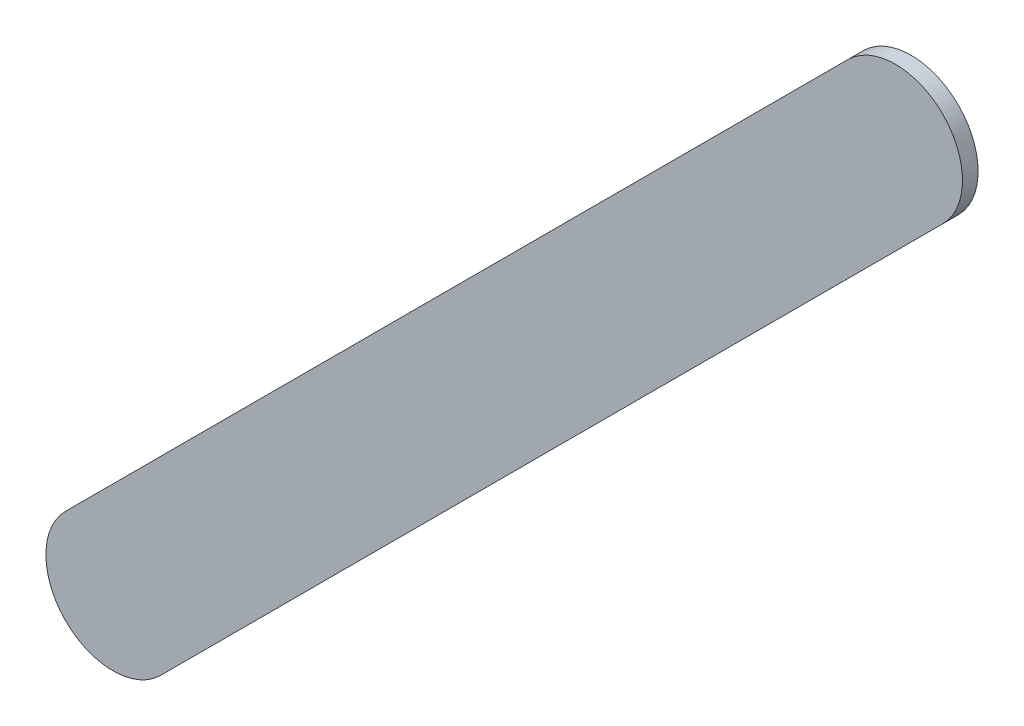
ISO-10303-21;
HEADER;
FILE_DESCRIPTION(('STEP AP214'),'2;1');
FILE_NAME('part.step','',(''),(''),'','','');
FILE_SCHEMA(('AUTOMOTIVE_DESIGN { 1 0 10303 214 1 1 1 1 }'));
ENDSEC;
DATA;
#1=APPLICATION_CONTEXT('core data for automotive mechanical design processes');
#2=APPLICATION_PROTOCOL_DEFINITION('international standard','automotive_design',2000,#1);
#3=PRODUCT_CONTEXT('',#1,'mechanical');
#4=PRODUCT('Part','Part','',(#3));
#5=PRODUCT_RELATED_PRODUCT_CATEGORY('part','',(#4));
#6=PRODUCT_DEFINITION_FORMATION('','',#4);
#7=PRODUCT_DEFINITION_CONTEXT('part definition',#1,'design');
#8=PRODUCT_DEFINITION('design','',#6,#7);
#9=PRODUCT_DEFINITION_SHAPE('','',#8);
#10=(LENGTH_UNIT() NAMED_UNIT(*) SI_UNIT(.MILLI.,.METRE.));
#11=(NAMED_UNIT(*) PLANE_ANGLE_UNIT() SI_UNIT($,.RADIAN.));
#12=(NAMED_UNIT(*) SI_UNIT($,.STERADIAN.) SOLID_ANGLE_UNIT());
#13=UNCERTAINTY_MEASURE_WITH_UNIT(LENGTH_MEASURE(1.E-05),#10,'distance_accuracy_value','');
#14=(GEOMETRIC_REPRESENTATION_CONTEXT(3) GLOBAL_UNCERTAINTY_ASSIGNED_CONTEXT((#13)) GLOBAL_UNIT_ASSIGNED_CONTEXT((#10,
#11,#12)) REPRESENTATION_CONTEXT('',''));
#15=CARTESIAN_POINT('',(0.,0.,0.));
#16=DIRECTION('',(0.,0.,1.));
#17=DIRECTION('',(1.,0.,0.));
#18=AXIS2_PLACEMENT_3D('',#15,#16,#17);
#19=CARTESIAN_POINT('',(85.396066,-74.696066,1.635));
#20=DIRECTION('',(0.,0.,1.));
#21=DIRECTION('',(1.,0.,0.));
#22=AXIS2_PLACEMENT_3D('',#19,#20,#21);
#23=PLANE('',#22);
#24=DIRECTION('',(0.707106781186548,0.707106781186548,0.));
#25=VECTOR('',#24,1.);
#26=CARTESIAN_POINT('',(85.396066,-74.696066,1.635));
#27=LINE('',#26,#25);
#28=CARTESIAN_POINT('',(85.396066,-74.696066,1.635));
#29=VERTEX_POINT('',#28);
#30=CARTESIAN_POINT('',(87.146066,-72.946066,1.635));
#31=VERTEX_POINT('',#30);
#32=EDGE_CURVE('E93',#29,#31,#27,.T.);
#33=ORIENTED_EDGE('',*,*,#32,.T.);
#34=CARTESIAN_POINT('',(87.0399995,-72.8399995,1.635));
#35=DIRECTION('',(0.,0.,1.));
#36=DIRECTION('',(0.707106781186548,-0.707106781186548,0.));
#37=AXIS2_PLACEMENT_3D('',#34,#35,#36);
#38=CIRCLE('',#37,0.150000682813);
#39=CARTESIAN_POINT('',(86.933933,-72.733933,1.635));
#40=VERTEX_POINT('',#39);
#41=EDGE_CURVE('E71',#31,#40,#38,.T.);
#42=ORIENTED_EDGE('',*,*,#41,.T.);
#43=DIRECTION('',(-0.707106781186548,-0.707106781186548,0.));
#44=VECTOR('',#43,1.);
#45=CARTESIAN_POINT('',(86.933933,-72.733933,1.635));
#46=LINE('',#45,#44);
#47=CARTESIAN_POINT('',(85.183933,-74.483933,1.635));
#48=VERTEX_POINT('',#47);
#49=EDGE_CURVE('E76',#40,#48,#46,.T.);
#50=ORIENTED_EDGE('',*,*,#49,.T.);
#51=CARTESIAN_POINT('',(85.2899995,-74.5899995,1.635));
#52=DIRECTION('',(0.,0.,1.));
#53=DIRECTION('',(-0.707106781186548,0.707106781186548,0.));
#54=AXIS2_PLACEMENT_3D('',#51,#52,#53);
#55=CIRCLE('',#54,0.150000682813);
#56=EDGE_CURVE('E11',#48,#29,#55,.T.);
#57=ORIENTED_EDGE('',*,*,#56,.T.);
#58=EDGE_LOOP('',(#33,#42,#50,#57));
#59=FACE_BOUND('',#58,.T.);
#60=ADVANCED_FACE('F17',(#59),#23,.T.);
#61=CARTESIAN_POINT('',(85.396066,-74.696066,1.6));
#62=DIRECTION('',(0.,0.,1.));
#63=DIRECTION('',(1.,0.,0.));
#64=AXIS2_PLACEMENT_3D('',#61,#62,#63);
#65=PLANE('',#64);
#66=CARTESIAN_POINT('',(85.2899995,-74.5899995,1.6));
#67=DIRECTION('',(0.,0.,1.));
#68=DIRECTION('',(-0.707106781186548,0.707106781186548,0.));
#69=AXIS2_PLACEMENT_3D('',#66,#67,#68);
#70=CIRCLE('',#69,0.150000682813);
#71=CARTESIAN_POINT('',(85.183933,-74.483933,1.6));
#72=VERTEX_POINT('',#71);
#73=CARTESIAN_POINT('',(85.396066,-74.696066,1.6));
#74=VERTEX_POINT('',#73);
#75=EDGE_CURVE('E25',#72,#74,#70,.T.);
#76=ORIENTED_EDGE('',*,*,#75,.F.);
#77=DIRECTION('',(-0.707106781186548,-0.707106781186548,0.));
#78=VECTOR('',#77,1.);
#79=CARTESIAN_POINT('',(86.933933,-72.733933,1.6));
#80=LINE('',#79,#78);
#81=CARTESIAN_POINT('',(86.933933,-72.733933,1.6));
#82=VERTEX_POINT('',#81);
#83=EDGE_CURVE('E60',#82,#72,#80,.T.);
#84=ORIENTED_EDGE('',*,*,#83,.F.);
#85=CARTESIAN_POINT('',(87.0399995,-72.8399995,1.6));
#86=DIRECTION('',(0.,0.,1.));
#87=DIRECTION('',(0.707106781186548,-0.707106781186548,0.));
#88=AXIS2_PLACEMENT_3D('',#85,#86,#87);
#89=CIRCLE('',#88,0.150000682813);
#90=CARTESIAN_POINT('',(87.146066,-72.946066,1.6));
#91=VERTEX_POINT('',#90);
#92=EDGE_CURVE('E65',#91,#82,#89,.T.);
#93=ORIENTED_EDGE('',*,*,#92,.F.);
#94=DIRECTION('',(0.707106781186548,0.707106781186548,0.));
#95=VECTOR('',#94,1.);
#96=CARTESIAN_POINT('',(85.396066,-74.696066,1.6));
#97=LINE('',#96,#95);
#98=EDGE_CURVE('E111',#74,#91,#97,.T.);
#99=ORIENTED_EDGE('',*,*,#98,.F.);
#100=EDGE_LOOP('',(#76,#84,#93,#99));
#101=FACE_BOUND('',#100,.T.);
#102=ADVANCED_FACE('F62',(#101),#65,.F.);
#103=CARTESIAN_POINT('',(85.2899995,-74.5899995,1.6));
#104=DIRECTION('',(0.,0.,-1.));
#105=DIRECTION('',(-0.707106781186548,0.707106781186548,0.));
#106=AXIS2_PLACEMENT_3D('',#103,#104,#105);
#107=CYLINDRICAL_SURFACE('',#106,0.150000682813);
#108=ORIENTED_EDGE('',*,*,#75,.T.);
#109=DIRECTION('',(0.,0.,1.));
#110=VECTOR('',#109,1.);
#111=CARTESIAN_POINT('',(85.396066,-74.696066,1.6));
#112=LINE('',#111,#110);
#113=EDGE_CURVE('E87',#74,#29,#112,.T.);
#114=ORIENTED_EDGE('',*,*,#113,.T.);
#115=ORIENTED_EDGE('',*,*,#56,.F.);
#116=DIRECTION('',(0.,0.,1.));
#117=VECTOR('',#116,1.);
#118=CARTESIAN_POINT('',(85.183933,-74.483933,1.6));
#119=LINE('',#118,#117);
#120=EDGE_CURVE('E70',#72,#48,#119,.T.);
#121=ORIENTED_EDGE('',*,*,#120,.F.);
#122=EDGE_LOOP('',(#108,#114,#115,#121));
#123=FACE_BOUND('',#122,.T.);
#124=ADVANCED_FACE('F101',(#123),#107,.T.);
#125=CARTESIAN_POINT('',(86.933933,-72.733933,1.6));
#126=DIRECTION('',(0.707106781186548,-0.707106781186548,0.));
#127=DIRECTION('',(0.,0.,-1.));
#128=AXIS2_PLACEMENT_3D('',#125,#126,#127);
#129=PLANE('',#128);
#130=ORIENTED_EDGE('',*,*,#83,.T.);
#131=ORIENTED_EDGE('',*,*,#120,.T.);
#132=ORIENTED_EDGE('',*,*,#49,.F.);
#133=DIRECTION('',(0.,0.,1.));
#134=VECTOR('',#133,1.);
#135=CARTESIAN_POINT('',(86.933933,-72.733933,1.6));
#136=LINE('',#135,#134);
#137=EDGE_CURVE('E74',#82,#40,#136,.T.);
#138=ORIENTED_EDGE('',*,*,#137,.F.);
#139=EDGE_LOOP('',(#130,#131,#132,#138));
#140=FACE_BOUND('',#139,.T.);
#141=ADVANCED_FACE('F75',(#140),#129,.F.);
#142=CARTESIAN_POINT('',(87.0399995,-72.8399995,1.6));
#143=DIRECTION('',(0.,0.,-1.));
#144=DIRECTION('',(0.707106781186548,-0.707106781186548,0.));
#145=AXIS2_PLACEMENT_3D('',#142,#143,#144);
#146=CYLINDRICAL_SURFACE('',#145,0.150000682813);
#147=ORIENTED_EDGE('',*,*,#92,.T.);
#148=ORIENTED_EDGE('',*,*,#137,.T.);
#149=ORIENTED_EDGE('',*,*,#41,.F.);
#150=DIRECTION('',(0.,0.,1.));
#151=VECTOR('',#150,1.);
#152=CARTESIAN_POINT('',(87.146066,-72.946066,1.6));
#153=LINE('',#152,#151);
#154=EDGE_CURVE('E84',#91,#31,#153,.T.);
#155=ORIENTED_EDGE('',*,*,#154,.F.);
#156=EDGE_LOOP('',(#147,#148,#149,#155));
#157=FACE_BOUND('',#156,.T.);
#158=ADVANCED_FACE('F82',(#157),#146,.T.);
#159=CARTESIAN_POINT('',(85.396066,-74.696066,1.6));
#160=DIRECTION('',(-0.707106781186548,0.707106781186548,0.));
#161=DIRECTION('',(0.,0.,1.));
#162=AXIS2_PLACEMENT_3D('',#159,#160,#161);
#163=PLANE('',#162);
#164=ORIENTED_EDGE('',*,*,#98,.T.);
#165=ORIENTED_EDGE('',*,*,#154,.T.);
#166=ORIENTED_EDGE('',*,*,#32,.F.);
#167=ORIENTED_EDGE('',*,*,#113,.F.);
#168=EDGE_LOOP('',(#164,#165,#166,#167));
#169=FACE_BOUND('',#168,.T.);
#170=ADVANCED_FACE('F110',(#169),#163,.F.);
#171=CLOSED_SHELL('',(#60,#102,#124,#141,#158,#170));
#172=MANIFOLD_SOLID_BREP('B1',#171);
#173=ADVANCED_BREP_SHAPE_REPRESENTATION('',(#18,#172),#14);
#174=SHAPE_DEFINITION_REPRESENTATION(#9,#173);
ENDSEC;
END-ISO-10303-21;
